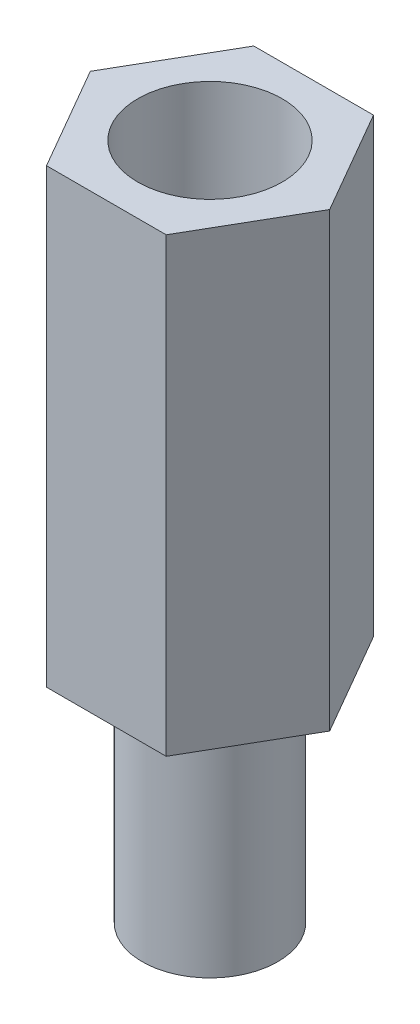
ISO-10303-21;
HEADER;
FILE_DESCRIPTION(('STEP AP214'),'2;1');
FILE_NAME('part.step','',(''),(''),'','','');
FILE_SCHEMA(('AUTOMOTIVE_DESIGN { 1 0 10303 214 1 1 1 1 }'));
ENDSEC;
DATA;
#1=APPLICATION_CONTEXT('core data for automotive mechanical design processes');
#2=APPLICATION_PROTOCOL_DEFINITION('international standard','automotive_design',2000,#1);
#3=PRODUCT_CONTEXT('',#1,'mechanical');
#4=PRODUCT('Part','Part','',(#3));
#5=PRODUCT_RELATED_PRODUCT_CATEGORY('part','',(#4));
#6=PRODUCT_DEFINITION_FORMATION('','',#4);
#7=PRODUCT_DEFINITION_CONTEXT('part definition',#1,'design');
#8=PRODUCT_DEFINITION('design','',#6,#7);
#9=PRODUCT_DEFINITION_SHAPE('','',#8);
#10=(LENGTH_UNIT() NAMED_UNIT(*) SI_UNIT(.MILLI.,.METRE.));
#11=(NAMED_UNIT(*) PLANE_ANGLE_UNIT() SI_UNIT($,.RADIAN.));
#12=(NAMED_UNIT(*) SI_UNIT($,.STERADIAN.) SOLID_ANGLE_UNIT());
#13=UNCERTAINTY_MEASURE_WITH_UNIT(LENGTH_MEASURE(1.E-05),#10,'distance_accuracy_value','');
#14=(GEOMETRIC_REPRESENTATION_CONTEXT(3) GLOBAL_UNCERTAINTY_ASSIGNED_CONTEXT((#13)) GLOBAL_UNIT_ASSIGNED_CONTEXT((#10,
#11,#12)) REPRESENTATION_CONTEXT('',''));
#15=CARTESIAN_POINT('',(0.,0.,0.));
#16=DIRECTION('',(0.,0.,1.));
#17=DIRECTION('',(1.,0.,0.));
#18=AXIS2_PLACEMENT_3D('',#15,#16,#17);
#19=CARTESIAN_POINT('',(1.32500000000003,10.,2.29496732002875));
#20=DIRECTION('',(-0.866025403784442,0.,-0.499999999999995));
#21=DIRECTION('',(-0.499999999999995,0.,0.866025403784442));
#22=AXIS2_PLACEMENT_3D('',#19,#20,#21);
#23=PLANE('',#22);
#24=DIRECTION('',(0.499999999999995,0.,-0.866025403784442));
#25=VECTOR('',#24,1.);
#26=CARTESIAN_POINT('',(1.32500000000003,0.,2.29496732002875));
#27=LINE('',#26,#25);
#28=CARTESIAN_POINT('',(1.32500000000003,0.,2.29496732002875));
#29=VERTEX_POINT('',#28);
#30=CARTESIAN_POINT('',(2.65,0.,0.));
#31=VERTEX_POINT('',#30);
#32=EDGE_CURVE('E130',#29,#31,#27,.T.);
#33=ORIENTED_EDGE('',*,*,#32,.T.);
#34=DIRECTION('',(0.,-1.,0.));
#35=VECTOR('',#34,1.);
#36=CARTESIAN_POINT('',(2.65,10.,0.));
#37=LINE('',#36,#35);
#38=CARTESIAN_POINT('',(2.65,10.,0.));
#39=VERTEX_POINT('',#38);
#40=EDGE_CURVE('E42',#39,#31,#37,.T.);
#41=ORIENTED_EDGE('',*,*,#40,.F.);
#42=DIRECTION('',(0.499999999999995,0.,-0.866025403784442));
#43=VECTOR('',#42,1.);
#44=CARTESIAN_POINT('',(1.32500000000003,10.,2.29496732002875));
#45=LINE('',#44,#43);
#46=CARTESIAN_POINT('',(1.32500000000003,10.,2.29496732002875));
#47=VERTEX_POINT('',#46);
#48=EDGE_CURVE('E147',#47,#39,#45,.T.);
#49=ORIENTED_EDGE('',*,*,#48,.F.);
#50=DIRECTION('',(0.,-1.,0.));
#51=VECTOR('',#50,1.);
#52=CARTESIAN_POINT('',(1.32500000000003,10.,2.29496732002875));
#53=LINE('',#52,#51);
#54=EDGE_CURVE('E126',#47,#29,#53,.T.);
#55=ORIENTED_EDGE('',*,*,#54,.T.);
#56=EDGE_LOOP('',(#33,#41,#49,#55));
#57=FACE_BOUND('',#56,.T.);
#58=ADVANCED_FACE('F39',(#57),#23,.F.);
#59=CARTESIAN_POINT('',(2.65,10.,0.));
#60=DIRECTION('',(-0.866025403784438,0.,0.500000000000001));
#61=DIRECTION('',(0.500000000000001,0.,0.866025403784438));
#62=AXIS2_PLACEMENT_3D('',#59,#60,#61);
#63=PLANE('',#62);
#64=DIRECTION('',(-0.500000000000001,0.,-0.866025403784438));
#65=VECTOR('',#64,1.);
#66=CARTESIAN_POINT('',(2.65,0.,0.));
#67=LINE('',#66,#65);
#68=CARTESIAN_POINT('',(1.32499999999999,0.,-2.29496732002877));
#69=VERTEX_POINT('',#68);
#70=EDGE_CURVE('E134',#31,#69,#67,.T.);
#71=ORIENTED_EDGE('',*,*,#70,.T.);
#72=DIRECTION('',(0.,-1.,0.));
#73=VECTOR('',#72,1.);
#74=CARTESIAN_POINT('',(1.32499999999999,10.,-2.29496732002877));
#75=LINE('',#74,#73);
#76=CARTESIAN_POINT('',(1.32499999999999,10.,-2.29496732002877));
#77=VERTEX_POINT('',#76);
#78=EDGE_CURVE('E153',#77,#69,#75,.T.);
#79=ORIENTED_EDGE('',*,*,#78,.F.);
#80=DIRECTION('',(-0.500000000000001,0.,-0.866025403784438));
#81=VECTOR('',#80,1.);
#82=CARTESIAN_POINT('',(2.65,10.,0.));
#83=LINE('',#82,#81);
#84=EDGE_CURVE('E95',#39,#77,#83,.T.);
#85=ORIENTED_EDGE('',*,*,#84,.F.);
#86=ORIENTED_EDGE('',*,*,#40,.T.);
#87=EDGE_LOOP('',(#71,#79,#85,#86));
#88=FACE_BOUND('',#87,.T.);
#89=ADVANCED_FACE('F160',(#88),#63,.F.);
#90=CARTESIAN_POINT('',(1.32499999999999,10.,-2.29496732002877));
#91=DIRECTION('',(0.,0.,1.));
#92=DIRECTION('',(1.,0.,0.));
#93=AXIS2_PLACEMENT_3D('',#90,#91,#92);
#94=PLANE('',#93);
#95=DIRECTION('',(-1.,0.,0.));
#96=VECTOR('',#95,1.);
#97=CARTESIAN_POINT('',(1.32499999999999,0.,-2.29496732002877));
#98=LINE('',#97,#96);
#99=CARTESIAN_POINT('',(-1.32500000000001,0.,-2.29496732002876));
#100=VERTEX_POINT('',#99);
#101=EDGE_CURVE('E138',#69,#100,#98,.T.);
#102=ORIENTED_EDGE('',*,*,#101,.T.);
#103=DIRECTION('',(0.,-1.,0.));
#104=VECTOR('',#103,1.);
#105=CARTESIAN_POINT('',(-1.32500000000001,10.,-2.29496732002876));
#106=LINE('',#105,#104);
#107=CARTESIAN_POINT('',(-1.32500000000001,10.,-2.29496732002876));
#108=VERTEX_POINT('',#107);
#109=EDGE_CURVE('E119',#108,#100,#106,.T.);
#110=ORIENTED_EDGE('',*,*,#109,.F.);
#111=DIRECTION('',(-1.,0.,0.));
#112=VECTOR('',#111,1.);
#113=CARTESIAN_POINT('',(1.32499999999999,10.,-2.29496732002877));
#114=LINE('',#113,#112);
#115=EDGE_CURVE('E108',#77,#108,#114,.T.);
#116=ORIENTED_EDGE('',*,*,#115,.F.);
#117=ORIENTED_EDGE('',*,*,#78,.T.);
#118=EDGE_LOOP('',(#102,#110,#116,#117));
#119=FACE_BOUND('',#118,.T.);
#120=ADVANCED_FACE('F166',(#119),#94,.F.);
#121=CARTESIAN_POINT('',(-1.32500000000001,10.,-2.29496732002876));
#122=DIRECTION('',(0.866025403784442,0.,0.499999999999995));
#123=DIRECTION('',(0.499999999999995,0.,-0.866025403784442));
#124=AXIS2_PLACEMENT_3D('',#121,#122,#123);
#125=PLANE('',#124);
#126=DIRECTION('',(-0.499999999999995,0.,0.866025403784442));
#127=VECTOR('',#126,1.);
#128=CARTESIAN_POINT('',(-1.32500000000001,0.,-2.29496732002876));
#129=LINE('',#128,#127);
#130=CARTESIAN_POINT('',(-2.65,0.,0.));
#131=VERTEX_POINT('',#130);
#132=EDGE_CURVE('E117',#100,#131,#129,.T.);
#133=ORIENTED_EDGE('',*,*,#132,.T.);
#134=DIRECTION('',(0.,-1.,0.));
#135=VECTOR('',#134,1.);
#136=CARTESIAN_POINT('',(-2.65,10.,0.));
#137=LINE('',#136,#135);
#138=CARTESIAN_POINT('',(-2.65,10.,0.));
#139=VERTEX_POINT('',#138);
#140=EDGE_CURVE('E114',#139,#131,#137,.T.);
#141=ORIENTED_EDGE('',*,*,#140,.F.);
#142=DIRECTION('',(-0.499999999999995,0.,0.866025403784442));
#143=VECTOR('',#142,1.);
#144=CARTESIAN_POINT('',(-1.32500000000001,10.,-2.29496732002876));
#145=LINE('',#144,#143);
#146=EDGE_CURVE('E102',#108,#139,#145,.T.);
#147=ORIENTED_EDGE('',*,*,#146,.F.);
#148=ORIENTED_EDGE('',*,*,#109,.T.);
#149=EDGE_LOOP('',(#133,#141,#147,#148));
#150=FACE_BOUND('',#149,.T.);
#151=ADVANCED_FACE('F115',(#150),#125,.F.);
#152=CARTESIAN_POINT('',(-2.65,10.,0.));
#153=DIRECTION('',(0.866025403784435,0.,-0.500000000000007));
#154=DIRECTION('',(-0.500000000000007,0.,-0.866025403784435));
#155=AXIS2_PLACEMENT_3D('',#152,#153,#154);
#156=PLANE('',#155);
#157=DIRECTION('',(0.500000000000007,0.,0.866025403784435));
#158=VECTOR('',#157,1.);
#159=CARTESIAN_POINT('',(-2.65,0.,0.));
#160=LINE('',#159,#158);
#161=CARTESIAN_POINT('',(-1.32499999999998,0.,2.29496732002877));
#162=VERTEX_POINT('',#161);
#163=EDGE_CURVE('E80',#131,#162,#160,.T.);
#164=ORIENTED_EDGE('',*,*,#163,.T.);
#165=DIRECTION('',(0.,-1.,0.));
#166=VECTOR('',#165,1.);
#167=CARTESIAN_POINT('',(-1.32499999999998,10.,2.29496732002877));
#168=LINE('',#167,#166);
#169=CARTESIAN_POINT('',(-1.32499999999998,10.,2.29496732002877));
#170=VERTEX_POINT('',#169);
#171=EDGE_CURVE('E120',#170,#162,#168,.T.);
#172=ORIENTED_EDGE('',*,*,#171,.F.);
#173=DIRECTION('',(0.500000000000007,0.,0.866025403784435));
#174=VECTOR('',#173,1.);
#175=CARTESIAN_POINT('',(-2.65,10.,0.));
#176=LINE('',#175,#174);
#177=EDGE_CURVE('E106',#139,#170,#176,.T.);
#178=ORIENTED_EDGE('',*,*,#177,.F.);
#179=ORIENTED_EDGE('',*,*,#140,.T.);
#180=EDGE_LOOP('',(#164,#172,#178,#179));
#181=FACE_BOUND('',#180,.T.);
#182=ADVANCED_FACE('F122',(#181),#156,.F.);
#183=CARTESIAN_POINT('',(-1.32499999999998,10.,2.29496732002877));
#184=DIRECTION('',(0.,0.,-1.));
#185=DIRECTION('',(-1.,0.,0.));
#186=AXIS2_PLACEMENT_3D('',#183,#184,#185);
#187=PLANE('',#186);
#188=DIRECTION('',(1.,0.,0.));
#189=VECTOR('',#188,1.);
#190=CARTESIAN_POINT('',(-1.32499999999998,0.,2.29496732002877));
#191=LINE('',#190,#189);
#192=EDGE_CURVE('E86',#162,#29,#191,.T.);
#193=ORIENTED_EDGE('',*,*,#192,.T.);
#194=ORIENTED_EDGE('',*,*,#54,.F.);
#195=DIRECTION('',(1.,0.,0.));
#196=VECTOR('',#195,1.);
#197=CARTESIAN_POINT('',(-1.32499999999998,10.,2.29496732002877));
#198=LINE('',#197,#196);
#199=EDGE_CURVE('E57',#170,#47,#198,.T.);
#200=ORIENTED_EDGE('',*,*,#199,.F.);
#201=ORIENTED_EDGE('',*,*,#171,.T.);
#202=EDGE_LOOP('',(#193,#194,#200,#201));
#203=FACE_BOUND('',#202,.T.);
#204=ADVANCED_FACE('F203',(#203),#187,.F.);
#205=CARTESIAN_POINT('',(0.,10.,0.));
#206=DIRECTION('',(0.,1.,0.));
#207=DIRECTION('',(0.,0.,1.));
#208=AXIS2_PLACEMENT_3D('',#205,#206,#207);
#209=PLANE('',#208);
#210=CARTESIAN_POINT('',(0.,10.,0.));
#211=DIRECTION('',(0.,1.,0.));
#212=DIRECTION('',(0.,0.,1.));
#213=AXIS2_PLACEMENT_3D('',#210,#211,#212);
#214=CIRCLE('',#213,1.6);
#215=CARTESIAN_POINT('',(0.,10.,1.6));
#216=VERTEX_POINT('',#215);
#217=EDGE_CURVE('E173',#216,#216,#214,.T.);
#218=ORIENTED_EDGE('',*,*,#217,.F.);
#219=EDGE_LOOP('',(#218));
#220=FACE_BOUND('',#219,.T.);
#221=ORIENTED_EDGE('',*,*,#48,.T.);
#222=ORIENTED_EDGE('',*,*,#84,.T.);
#223=ORIENTED_EDGE('',*,*,#115,.T.);
#224=ORIENTED_EDGE('',*,*,#146,.T.);
#225=ORIENTED_EDGE('',*,*,#177,.T.);
#226=ORIENTED_EDGE('',*,*,#199,.T.);
#227=EDGE_LOOP('',(#221,#222,#223,#224,#225,#226));
#228=FACE_BOUND('',#227,.T.);
#229=ADVANCED_FACE('F104',(#220,#228),#209,.T.);
#230=CARTESIAN_POINT('',(0.,0.,0.));
#231=DIRECTION('',(0.,1.,0.));
#232=DIRECTION('',(0.,0.,1.));
#233=AXIS2_PLACEMENT_3D('',#230,#231,#232);
#234=PLANE('',#233);
#235=CARTESIAN_POINT('',(0.,0.,0.));
#236=DIRECTION('',(0.,-1.,0.));
#237=DIRECTION('',(0.,0.,-1.));
#238=AXIS2_PLACEMENT_3D('',#235,#236,#237);
#239=CIRCLE('',#238,1.5);
#240=CARTESIAN_POINT('',(0.,0.,-1.5));
#241=VERTEX_POINT('',#240);
#242=EDGE_CURVE('E11',#241,#241,#239,.T.);
#243=ORIENTED_EDGE('',*,*,#242,.F.);
#244=EDGE_LOOP('',(#243));
#245=FACE_BOUND('',#244,.T.);
#246=ORIENTED_EDGE('',*,*,#32,.F.);
#247=ORIENTED_EDGE('',*,*,#192,.F.);
#248=ORIENTED_EDGE('',*,*,#163,.F.);
#249=ORIENTED_EDGE('',*,*,#132,.F.);
#250=ORIENTED_EDGE('',*,*,#101,.F.);
#251=ORIENTED_EDGE('',*,*,#70,.F.);
#252=EDGE_LOOP('',(#246,#247,#248,#249,#250,#251));
#253=FACE_BOUND('',#252,.T.);
#254=ADVANCED_FACE('F165',(#245,#253),#234,.F.);
#255=CARTESIAN_POINT('',(0.,5.,0.));
#256=DIRECTION('',(0.,1.,0.));
#257=DIRECTION('',(0.,0.,1.));
#258=AXIS2_PLACEMENT_3D('',#255,#256,#257);
#259=CYLINDRICAL_SURFACE('',#258,1.6);
#260=CARTESIAN_POINT('',(0.,5.,0.));
#261=DIRECTION('',(0.,1.,0.));
#262=DIRECTION('',(0.,0.,1.));
#263=AXIS2_PLACEMENT_3D('',#260,#261,#262);
#264=CIRCLE('',#263,1.6);
#265=CARTESIAN_POINT('',(0.,5.,1.6));
#266=VERTEX_POINT('',#265);
#267=EDGE_CURVE('E135',#266,#266,#264,.T.);
#268=ORIENTED_EDGE('',*,*,#267,.F.);
#269=EDGE_LOOP('',(#268));
#270=FACE_BOUND('',#269,.T.);
#271=ORIENTED_EDGE('',*,*,#217,.T.);
#272=EDGE_LOOP('',(#271));
#273=FACE_BOUND('',#272,.T.);
#274=ADVANCED_FACE('F195',(#270,#273),#259,.F.);
#275=CARTESIAN_POINT('',(0.,5.,0.));
#276=DIRECTION('',(0.,1.,0.));
#277=DIRECTION('',(0.,0.,1.));
#278=AXIS2_PLACEMENT_3D('',#275,#276,#277);
#279=PLANE('',#278);
#280=ORIENTED_EDGE('',*,*,#267,.T.);
#281=EDGE_LOOP('',(#280));
#282=FACE_BOUND('',#281,.T.);
#283=ADVANCED_FACE('F190',(#282),#279,.T.);
#284=CARTESIAN_POINT('',(0.,-5.,0.));
#285=DIRECTION('',(0.,1.,0.));
#286=DIRECTION('',(0.,0.,1.));
#287=AXIS2_PLACEMENT_3D('',#284,#285,#286);
#288=CYLINDRICAL_SURFACE('',#287,1.5);
#289=CARTESIAN_POINT('',(0.,-5.,0.));
#290=DIRECTION('',(0.,-1.,0.));
#291=DIRECTION('',(0.,0.,-1.));
#292=AXIS2_PLACEMENT_3D('',#289,#290,#291);
#293=CIRCLE('',#292,1.5);
#294=CARTESIAN_POINT('',(0.,-5.,-1.5));
#295=VERTEX_POINT('',#294);
#296=EDGE_CURVE('E177',#295,#295,#293,.T.);
#297=ORIENTED_EDGE('',*,*,#296,.F.);
#298=EDGE_LOOP('',(#297));
#299=FACE_BOUND('',#298,.T.);
#300=ORIENTED_EDGE('',*,*,#242,.T.);
#301=EDGE_LOOP('',(#300));
#302=FACE_BOUND('',#301,.T.);
#303=ADVANCED_FACE('F187',(#299,#302),#288,.T.);
#304=CARTESIAN_POINT('',(0.,-5.,0.));
#305=DIRECTION('',(0.,-1.,0.));
#306=DIRECTION('',(0.,0.,-1.));
#307=AXIS2_PLACEMENT_3D('',#304,#305,#306);
#308=PLANE('',#307);
#309=ORIENTED_EDGE('',*,*,#296,.T.);
#310=EDGE_LOOP('',(#309));
#311=FACE_BOUND('',#310,.T.);
#312=ADVANCED_FACE('F185',(#311),#308,.T.);
#313=CLOSED_SHELL('',(#58,#89,#120,#151,#182,#204,#229,#254,#274,#283,#303,#312));
#314=MANIFOLD_SOLID_BREP('B2',#313);
#315=ADVANCED_BREP_SHAPE_REPRESENTATION('',(#18,#314),#14);
#316=SHAPE_DEFINITION_REPRESENTATION(#9,#315);
ENDSEC;
END-ISO-10303-21;
